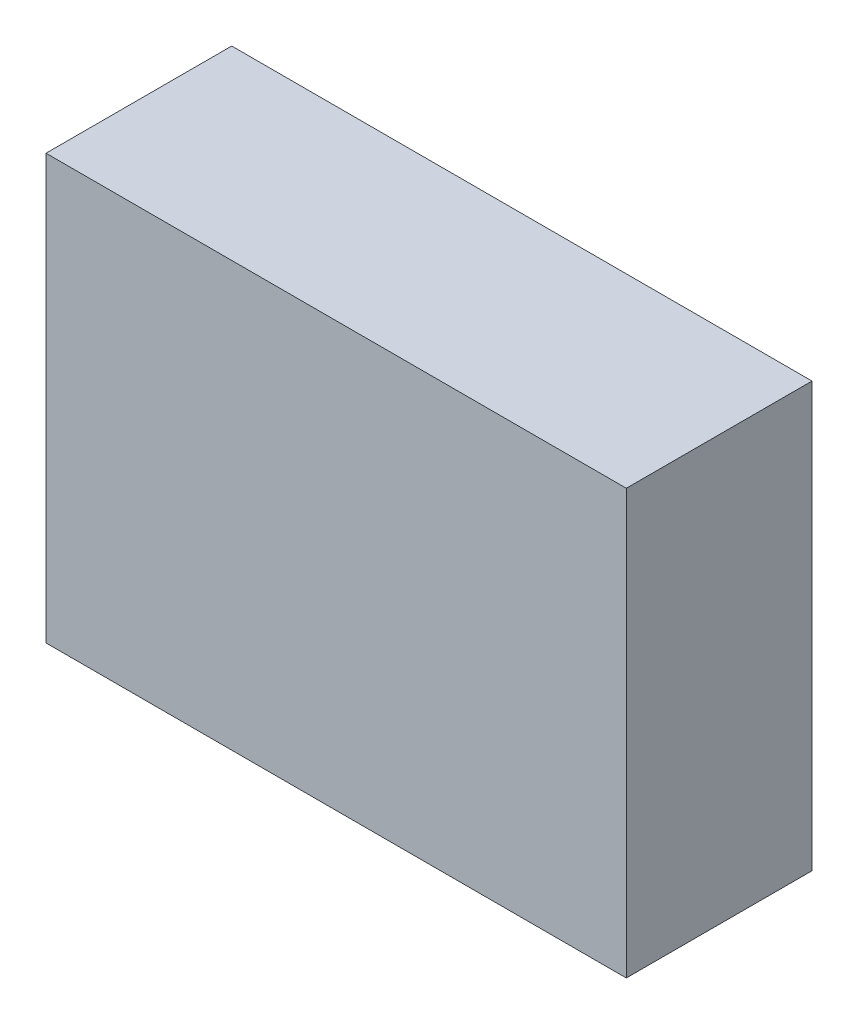
ISO-10303-21;
HEADER;
FILE_DESCRIPTION(('STEP AP214'),'2;1');
FILE_NAME('part.step','',(''),(''),'','','');
FILE_SCHEMA(('AUTOMOTIVE_DESIGN { 1 0 10303 214 1 1 1 1 }'));
ENDSEC;
DATA;
#1=APPLICATION_CONTEXT('core data for automotive mechanical design processes');
#2=APPLICATION_PROTOCOL_DEFINITION('international standard','automotive_design',2000,#1);
#3=PRODUCT_CONTEXT('',#1,'mechanical');
#4=PRODUCT('Part','Part','',(#3));
#5=PRODUCT_RELATED_PRODUCT_CATEGORY('part','',(#4));
#6=PRODUCT_DEFINITION_FORMATION('','',#4);
#7=PRODUCT_DEFINITION_CONTEXT('part definition',#1,'design');
#8=PRODUCT_DEFINITION('design','',#6,#7);
#9=PRODUCT_DEFINITION_SHAPE('','',#8);
#10=(LENGTH_UNIT() NAMED_UNIT(*) SI_UNIT(.MILLI.,.METRE.));
#11=(NAMED_UNIT(*) PLANE_ANGLE_UNIT() SI_UNIT($,.RADIAN.));
#12=(NAMED_UNIT(*) SI_UNIT($,.STERADIAN.) SOLID_ANGLE_UNIT());
#13=UNCERTAINTY_MEASURE_WITH_UNIT(LENGTH_MEASURE(1.E-05),#10,'distance_accuracy_value','');
#14=(GEOMETRIC_REPRESENTATION_CONTEXT(3) GLOBAL_UNCERTAINTY_ASSIGNED_CONTEXT((#13)) GLOBAL_UNIT_ASSIGNED_CONTEXT((#10,
#11,#12)) REPRESENTATION_CONTEXT('',''));
#15=CARTESIAN_POINT('',(0.,0.,0.));
#16=DIRECTION('',(0.,0.,1.));
#17=DIRECTION('',(1.,0.,0.));
#18=AXIS2_PLACEMENT_3D('',#15,#16,#17);
#19=CARTESIAN_POINT('',(0.,0.,17.6));
#20=DIRECTION('',(0.,1.,0.));
#21=DIRECTION('',(0.,0.,1.));
#22=AXIS2_PLACEMENT_3D('',#19,#20,#21);
#23=PLANE('',#22);
#24=DIRECTION('',(1.,0.,0.));
#25=VECTOR('',#24,1.);
#26=CARTESIAN_POINT('',(0.,0.,0.));
#27=LINE('',#26,#25);
#28=CARTESIAN_POINT('',(-55.,0.,0.));
#29=VERTEX_POINT('',#28);
#30=CARTESIAN_POINT('',(0.,0.,0.));
#31=VERTEX_POINT('',#30);
#32=EDGE_CURVE('E119',#29,#31,#27,.T.);
#33=ORIENTED_EDGE('',*,*,#32,.T.);
#34=DIRECTION('',(0.,0.,-1.));
#35=VECTOR('',#34,1.);
#36=CARTESIAN_POINT('',(0.,0.,17.6));
#37=LINE('',#36,#35);
#38=CARTESIAN_POINT('',(0.,0.,17.6));
#39=VERTEX_POINT('',#38);
#40=EDGE_CURVE('E11',#39,#31,#37,.T.);
#41=ORIENTED_EDGE('',*,*,#40,.F.);
#42=DIRECTION('',(1.,0.,0.));
#43=VECTOR('',#42,1.);
#44=CARTESIAN_POINT('',(0.,0.,17.6));
#45=LINE('',#44,#43);
#46=CARTESIAN_POINT('',(-55.,0.,17.6));
#47=VERTEX_POINT('',#46);
#48=EDGE_CURVE('E103',#47,#39,#45,.T.);
#49=ORIENTED_EDGE('',*,*,#48,.F.);
#50=DIRECTION('',(0.,0.,-1.));
#51=VECTOR('',#50,1.);
#52=CARTESIAN_POINT('',(-55.,0.,17.6));
#53=LINE('',#52,#51);
#54=EDGE_CURVE('E115',#47,#29,#53,.T.);
#55=ORIENTED_EDGE('',*,*,#54,.T.);
#56=EDGE_LOOP('',(#33,#41,#49,#55));
#57=FACE_BOUND('',#56,.T.);
#58=ADVANCED_FACE('F51',(#57),#23,.F.);
#59=CARTESIAN_POINT('',(0.,0.,17.6));
#60=DIRECTION('',(-1.,0.,0.));
#61=DIRECTION('',(0.,0.,1.));
#62=AXIS2_PLACEMENT_3D('',#59,#60,#61);
#63=PLANE('',#62);
#64=DIRECTION('',(0.,1.,0.));
#65=VECTOR('',#64,1.);
#66=CARTESIAN_POINT('',(0.,0.,0.));
#67=LINE('',#66,#65);
#68=CARTESIAN_POINT('',(0.,40.2,0.));
#69=VERTEX_POINT('',#68);
#70=EDGE_CURVE('E108',#31,#69,#67,.T.);
#71=ORIENTED_EDGE('',*,*,#70,.T.);
#72=DIRECTION('',(0.,0.,-1.));
#73=VECTOR('',#72,1.);
#74=CARTESIAN_POINT('',(0.,40.2,17.6));
#75=LINE('',#74,#73);
#76=CARTESIAN_POINT('',(0.,40.2,17.6));
#77=VERTEX_POINT('',#76);
#78=EDGE_CURVE('E60',#77,#69,#75,.T.);
#79=ORIENTED_EDGE('',*,*,#78,.F.);
#80=DIRECTION('',(0.,1.,0.));
#81=VECTOR('',#80,1.);
#82=CARTESIAN_POINT('',(0.,0.,17.6));
#83=LINE('',#82,#81);
#84=EDGE_CURVE('E98',#39,#77,#83,.T.);
#85=ORIENTED_EDGE('',*,*,#84,.F.);
#86=ORIENTED_EDGE('',*,*,#40,.T.);
#87=EDGE_LOOP('',(#71,#79,#85,#86));
#88=FACE_BOUND('',#87,.T.);
#89=ADVANCED_FACE('F107',(#88),#63,.F.);
#90=CARTESIAN_POINT('',(0.,40.2,17.6));
#91=DIRECTION('',(0.,-1.,0.));
#92=DIRECTION('',(0.,0.,-1.));
#93=AXIS2_PLACEMENT_3D('',#90,#91,#92);
#94=PLANE('',#93);
#95=DIRECTION('',(-1.,0.,0.));
#96=VECTOR('',#95,1.);
#97=CARTESIAN_POINT('',(0.,40.2,0.));
#98=LINE('',#97,#96);
#99=CARTESIAN_POINT('',(-55.,40.2,0.));
#100=VERTEX_POINT('',#99);
#101=EDGE_CURVE('E85',#69,#100,#98,.T.);
#102=ORIENTED_EDGE('',*,*,#101,.T.);
#103=DIRECTION('',(0.,0.,-1.));
#104=VECTOR('',#103,1.);
#105=CARTESIAN_POINT('',(-55.,40.2,17.6));
#106=LINE('',#105,#104);
#107=CARTESIAN_POINT('',(-55.,40.2,17.6));
#108=VERTEX_POINT('',#107);
#109=EDGE_CURVE('E110',#108,#100,#106,.T.);
#110=ORIENTED_EDGE('',*,*,#109,.F.);
#111=DIRECTION('',(-1.,0.,0.));
#112=VECTOR('',#111,1.);
#113=CARTESIAN_POINT('',(0.,40.2,17.6));
#114=LINE('',#113,#112);
#115=EDGE_CURVE('E101',#77,#108,#114,.T.);
#116=ORIENTED_EDGE('',*,*,#115,.F.);
#117=ORIENTED_EDGE('',*,*,#78,.T.);
#118=EDGE_LOOP('',(#102,#110,#116,#117));
#119=FACE_BOUND('',#118,.T.);
#120=ADVANCED_FACE('F111',(#119),#94,.F.);
#121=CARTESIAN_POINT('',(-55.,0.,17.6));
#122=DIRECTION('',(1.,0.,0.));
#123=DIRECTION('',(0.,0.,-1.));
#124=AXIS2_PLACEMENT_3D('',#121,#122,#123);
#125=PLANE('',#124);
#126=DIRECTION('',(0.,-1.,0.));
#127=VECTOR('',#126,1.);
#128=CARTESIAN_POINT('',(-55.,0.,0.));
#129=LINE('',#128,#127);
#130=EDGE_CURVE('E91',#100,#29,#129,.T.);
#131=ORIENTED_EDGE('',*,*,#130,.T.);
#132=ORIENTED_EDGE('',*,*,#54,.F.);
#133=DIRECTION('',(0.,-1.,0.));
#134=VECTOR('',#133,1.);
#135=CARTESIAN_POINT('',(-55.,0.,17.6));
#136=LINE('',#135,#134);
#137=EDGE_CURVE('E68',#108,#47,#136,.T.);
#138=ORIENTED_EDGE('',*,*,#137,.F.);
#139=ORIENTED_EDGE('',*,*,#109,.T.);
#140=EDGE_LOOP('',(#131,#132,#138,#139));
#141=FACE_BOUND('',#140,.T.);
#142=ADVANCED_FACE('F132',(#141),#125,.F.);
#143=CARTESIAN_POINT('',(0.,0.,17.6));
#144=DIRECTION('',(0.,0.,-1.));
#145=DIRECTION('',(-1.,0.,0.));
#146=AXIS2_PLACEMENT_3D('',#143,#144,#145);
#147=PLANE('',#146);
#148=ORIENTED_EDGE('',*,*,#48,.T.);
#149=ORIENTED_EDGE('',*,*,#84,.T.);
#150=ORIENTED_EDGE('',*,*,#115,.T.);
#151=ORIENTED_EDGE('',*,*,#137,.T.);
#152=EDGE_LOOP('',(#148,#149,#150,#151));
#153=FACE_BOUND('',#152,.T.);
#154=ADVANCED_FACE('F99',(#153),#147,.F.);
#155=CARTESIAN_POINT('',(0.,0.,0.));
#156=DIRECTION('',(0.,0.,-1.));
#157=DIRECTION('',(-1.,0.,0.));
#158=AXIS2_PLACEMENT_3D('',#155,#156,#157);
#159=PLANE('',#158);
#160=ORIENTED_EDGE('',*,*,#32,.F.);
#161=ORIENTED_EDGE('',*,*,#130,.F.);
#162=ORIENTED_EDGE('',*,*,#101,.F.);
#163=ORIENTED_EDGE('',*,*,#70,.F.);
#164=EDGE_LOOP('',(#160,#161,#162,#163));
#165=FACE_BOUND('',#164,.T.);
#166=ADVANCED_FACE('F135',(#165),#159,.T.);
#167=CLOSED_SHELL('',(#58,#89,#120,#142,#154,#166));
#168=MANIFOLD_SOLID_BREP('B2',#167);
#169=ADVANCED_BREP_SHAPE_REPRESENTATION('',(#18,#168),#14);
#170=SHAPE_DEFINITION_REPRESENTATION(#9,#169);
ENDSEC;
END-ISO-10303-21;
